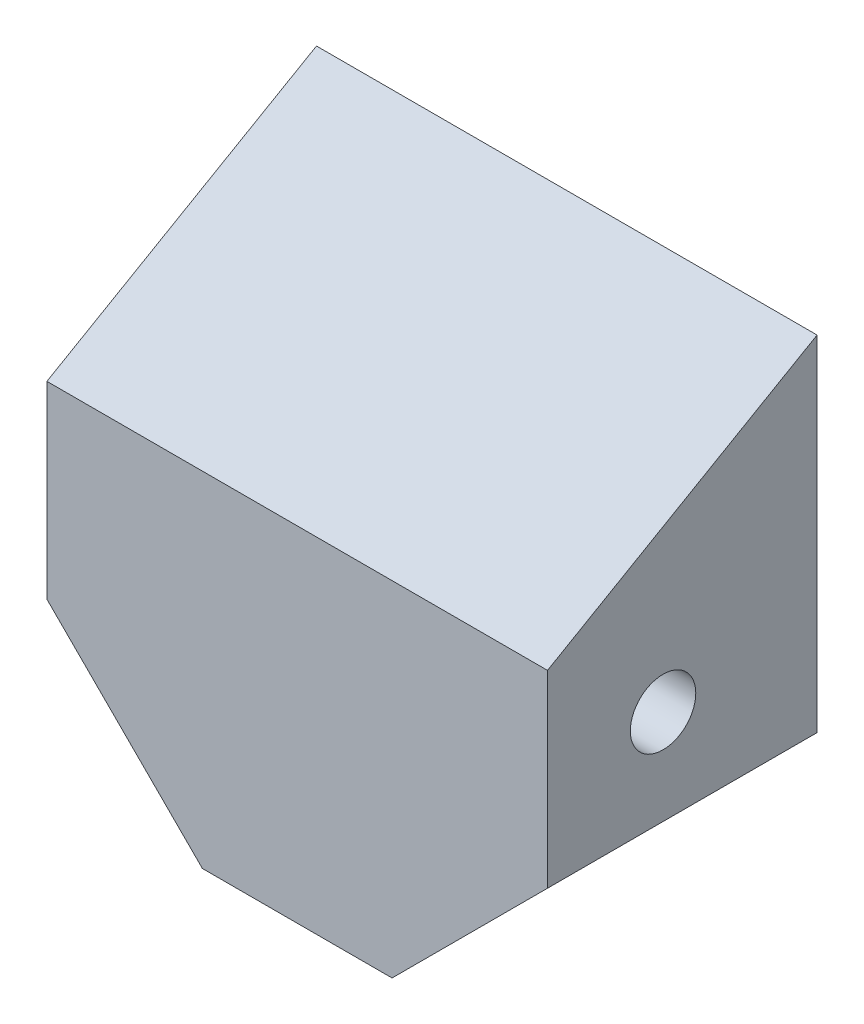
ISO-10303-21;
HEADER;
FILE_DESCRIPTION(('STEP AP214'),'2;1');
FILE_NAME('part.step','',(''),(''),'','','');
FILE_SCHEMA(('AUTOMOTIVE_DESIGN { 1 0 10303 214 1 1 1 1 }'));
ENDSEC;
DATA;
#1=APPLICATION_CONTEXT('core data for automotive mechanical design processes');
#2=APPLICATION_PROTOCOL_DEFINITION('international standard','automotive_design',2000,#1);
#3=PRODUCT_CONTEXT('',#1,'mechanical');
#4=PRODUCT('Part','Part','',(#3));
#5=PRODUCT_RELATED_PRODUCT_CATEGORY('part','',(#4));
#6=PRODUCT_DEFINITION_FORMATION('','',#4);
#7=PRODUCT_DEFINITION_CONTEXT('part definition',#1,'design');
#8=PRODUCT_DEFINITION('design','',#6,#7);
#9=PRODUCT_DEFINITION_SHAPE('','',#8);
#10=(LENGTH_UNIT() NAMED_UNIT(*) SI_UNIT(.MILLI.,.METRE.));
#11=(NAMED_UNIT(*) PLANE_ANGLE_UNIT() SI_UNIT($,.RADIAN.));
#12=(NAMED_UNIT(*) SI_UNIT($,.STERADIAN.) SOLID_ANGLE_UNIT());
#13=UNCERTAINTY_MEASURE_WITH_UNIT(LENGTH_MEASURE(1.E-05),#10,'distance_accuracy_value','');
#14=(GEOMETRIC_REPRESENTATION_CONTEXT(3) GLOBAL_UNCERTAINTY_ASSIGNED_CONTEXT((#13)) GLOBAL_UNIT_ASSIGNED_CONTEXT((#10,
#11,#12)) REPRESENTATION_CONTEXT('',''));
#15=CARTESIAN_POINT('',(0.,0.,0.));
#16=DIRECTION('',(0.,0.,1.));
#17=DIRECTION('',(1.,0.,0.));
#18=AXIS2_PLACEMENT_3D('',#15,#16,#17);
#19=CARTESIAN_POINT('',(165.1,-165.1,177.8));
#20=DIRECTION('',(-1.,0.,0.));
#21=DIRECTION('',(0.,0.,1.));
#22=AXIS2_PLACEMENT_3D('',#19,#20,#21);
#23=PLANE('',#22);
#24=CARTESIAN_POINT('',(165.1,0.,101.6));
#25=DIRECTION('',(-1.,0.,0.));
#26=DIRECTION('',(0.,0.,1.));
#27=AXIS2_PLACEMENT_3D('',#24,#25,#26);
#28=CIRCLE('',#27,21.59);
#29=CARTESIAN_POINT('',(165.1,0.,123.19));
#30=VERTEX_POINT('',#29);
#31=EDGE_CURVE('E135',#30,#30,#28,.T.);
#32=ORIENTED_EDGE('',*,*,#31,.T.);
#33=EDGE_LOOP('',(#32));
#34=FACE_BOUND('',#33,.T.);
#35=DIRECTION('',(0.,1.,0.));
#36=VECTOR('',#35,1.);
#37=CARTESIAN_POINT('',(165.1,-165.1,177.8));
#38=LINE('',#37,#36);
#39=CARTESIAN_POINT('',(165.1,-62.5599968000001,177.8));
#40=VERTEX_POINT('',#39);
#41=CARTESIAN_POINT('',(165.1,61.9044110375234,177.8));
#42=VERTEX_POINT('',#41);
#43=EDGE_CURVE('E140',#40,#42,#38,.T.);
#44=ORIENTED_EDGE('',*,*,#43,.F.);
#45=DIRECTION('',(0.,0.,-1.));
#46=VECTOR('',#45,1.);
#47=CARTESIAN_POINT('',(165.1,-62.5599968000001,177.8));
#48=LINE('',#47,#46);
#49=CARTESIAN_POINT('',(165.1,-62.5599968000001,0.));
#50=VERTEX_POINT('',#49);
#51=EDGE_CURVE('E214',#40,#50,#48,.T.);
#52=ORIENTED_EDGE('',*,*,#51,.T.);
#53=DIRECTION('',(0.,1.,0.));
#54=VECTOR('',#53,1.);
#55=CARTESIAN_POINT('',(165.1,-165.1,0.));
#56=LINE('',#55,#54);
#57=CARTESIAN_POINT('',(165.1,164.55728889944,0.));
#58=VERTEX_POINT('',#57);
#59=EDGE_CURVE('E139',#50,#58,#56,.T.);
#60=ORIENTED_EDGE('',*,*,#59,.T.);
#61=DIRECTION('',(0.,0.500000000000006,-0.866025403784435));
#62=VECTOR('',#61,1.);
#63=CARTESIAN_POINT('',(165.1,61.9044110375234,177.8));
#64=LINE('',#63,#62);
#65=EDGE_CURVE('E236',#58,#42,#64,.F.);
#66=ORIENTED_EDGE('',*,*,#65,.T.);
#67=EDGE_LOOP('',(#44,#52,#60,#66));
#68=FACE_BOUND('',#67,.T.);
#69=ADVANCED_FACE('F41',(#34,#68),#23,.F.);
#70=CARTESIAN_POINT('',(-165.1,-165.1,177.8));
#71=DIRECTION('',(1.,0.,0.));
#72=DIRECTION('',(0.,0.,-1.));
#73=AXIS2_PLACEMENT_3D('',#70,#71,#72);
#74=PLANE('',#73);
#75=CARTESIAN_POINT('',(-165.1,0.,101.6));
#76=DIRECTION('',(1.,0.,0.));
#77=DIRECTION('',(0.,0.,-1.));
#78=AXIS2_PLACEMENT_3D('',#75,#76,#77);
#79=CIRCLE('',#78,21.59);
#80=CARTESIAN_POINT('',(-165.1,0.,80.01));
#81=VERTEX_POINT('',#80);
#82=EDGE_CURVE('E131',#81,#81,#79,.T.);
#83=ORIENTED_EDGE('',*,*,#82,.T.);
#84=EDGE_LOOP('',(#83));
#85=FACE_BOUND('',#84,.T.);
#86=DIRECTION('',(0.,-1.,0.));
#87=VECTOR('',#86,1.);
#88=CARTESIAN_POINT('',(-165.1,-165.1,0.));
#89=LINE('',#88,#87);
#90=CARTESIAN_POINT('',(-165.1,164.55728889944,0.));
#91=VERTEX_POINT('',#90);
#92=CARTESIAN_POINT('',(-165.1,-62.5599967999997,0.));
#93=VERTEX_POINT('',#92);
#94=EDGE_CURVE('E152',#91,#93,#89,.T.);
#95=ORIENTED_EDGE('',*,*,#94,.T.);
#96=DIRECTION('',(0.,0.,1.));
#97=VECTOR('',#96,1.);
#98=CARTESIAN_POINT('',(-165.1,-62.5599967999997,177.8));
#99=LINE('',#98,#97);
#100=CARTESIAN_POINT('',(-165.1,-62.5599967999997,177.8));
#101=VERTEX_POINT('',#100);
#102=EDGE_CURVE('E11',#93,#101,#99,.T.);
#103=ORIENTED_EDGE('',*,*,#102,.T.);
#104=DIRECTION('',(0.,-1.,0.));
#105=VECTOR('',#104,1.);
#106=CARTESIAN_POINT('',(-165.1,-165.1,177.8));
#107=LINE('',#106,#105);
#108=CARTESIAN_POINT('',(-165.1,61.9044110375234,177.8));
#109=VERTEX_POINT('',#108);
#110=EDGE_CURVE('E143',#109,#101,#107,.T.);
#111=ORIENTED_EDGE('',*,*,#110,.F.);
#112=DIRECTION('',(0.,-0.500000000000006,0.866025403784435));
#113=VECTOR('',#112,1.);
#114=CARTESIAN_POINT('',(-165.1,61.9044110375234,177.8));
#115=LINE('',#114,#113);
#116=EDGE_CURVE('E244',#109,#91,#115,.F.);
#117=ORIENTED_EDGE('',*,*,#116,.T.);
#118=EDGE_LOOP('',(#95,#103,#111,#117));
#119=FACE_BOUND('',#118,.T.);
#120=ADVANCED_FACE('F188',(#85,#119),#74,.F.);
#121=CARTESIAN_POINT('',(-165.1,-165.1,177.8));
#122=DIRECTION('',(0.,1.,0.));
#123=DIRECTION('',(0.,0.,1.));
#124=AXIS2_PLACEMENT_3D('',#121,#122,#123);
#125=PLANE('',#124);
#126=CARTESIAN_POINT('',(0.,-165.1,101.6));
#127=DIRECTION('',(0.,-1.,0.));
#128=DIRECTION('',(0.,0.,-1.));
#129=AXIS2_PLACEMENT_3D('',#126,#127,#128);
#130=CIRCLE('',#129,21.59);
#131=CARTESIAN_POINT('',(0.,-165.1,80.01));
#132=VERTEX_POINT('',#131);
#133=EDGE_CURVE('E122',#132,#132,#130,.T.);
#134=ORIENTED_EDGE('',*,*,#133,.F.);
#135=EDGE_LOOP('',(#134));
#136=FACE_BOUND('',#135,.T.);
#137=DIRECTION('',(1.,0.,0.));
#138=VECTOR('',#137,1.);
#139=CARTESIAN_POINT('',(-165.1,-165.1,0.));
#140=LINE('',#139,#138);
#141=CARTESIAN_POINT('',(-62.5599968000001,-165.1,0.));
#142=VERTEX_POINT('',#141);
#143=CARTESIAN_POINT('',(62.5599967999997,-165.1,0.));
#144=VERTEX_POINT('',#143);
#145=EDGE_CURVE('E144',#142,#144,#140,.T.);
#146=ORIENTED_EDGE('',*,*,#145,.T.);
#147=DIRECTION('',(0.,0.,1.));
#148=VECTOR('',#147,1.);
#149=CARTESIAN_POINT('',(62.5599967999997,-165.1,177.8));
#150=LINE('',#149,#148);
#151=CARTESIAN_POINT('',(62.5599967999997,-165.1,177.8));
#152=VERTEX_POINT('',#151);
#153=EDGE_CURVE('E64',#144,#152,#150,.T.);
#154=ORIENTED_EDGE('',*,*,#153,.T.);
#155=DIRECTION('',(1.,0.,0.));
#156=VECTOR('',#155,1.);
#157=CARTESIAN_POINT('',(-165.1,-165.1,177.8));
#158=LINE('',#157,#156);
#159=CARTESIAN_POINT('',(-62.5599968000001,-165.1,177.8));
#160=VERTEX_POINT('',#159);
#161=EDGE_CURVE('E147',#160,#152,#158,.T.);
#162=ORIENTED_EDGE('',*,*,#161,.F.);
#163=DIRECTION('',(0.,0.,-1.));
#164=VECTOR('',#163,1.);
#165=CARTESIAN_POINT('',(-62.5599968000001,-165.1,177.8));
#166=LINE('',#165,#164);
#167=EDGE_CURVE('E224',#160,#142,#166,.T.);
#168=ORIENTED_EDGE('',*,*,#167,.T.);
#169=EDGE_LOOP('',(#146,#154,#162,#168));
#170=FACE_BOUND('',#169,.T.);
#171=ADVANCED_FACE('F194',(#136,#170),#125,.F.);
#172=CARTESIAN_POINT('',(0.,0.,177.8));
#173=DIRECTION('',(0.,0.,-1.));
#174=DIRECTION('',(-1.,0.,0.));
#175=AXIS2_PLACEMENT_3D('',#172,#173,#174);
#176=PLANE('',#175);
#177=ORIENTED_EDGE('',*,*,#161,.T.);
#178=DIRECTION('',(-0.707106781186549,-0.707106781186546,0.));
#179=VECTOR('',#178,1.);
#180=CARTESIAN_POINT('',(165.1,-62.5599968000001,177.8));
#181=LINE('',#180,#179);
#182=EDGE_CURVE('E51',#152,#40,#181,.F.);
#183=ORIENTED_EDGE('',*,*,#182,.T.);
#184=ORIENTED_EDGE('',*,*,#43,.T.);
#185=DIRECTION('',(-1.,0.,0.));
#186=VECTOR('',#185,1.);
#187=CARTESIAN_POINT('',(0.,61.9044110375234,177.8));
#188=LINE('',#187,#186);
#189=EDGE_CURVE('E246',#42,#109,#188,.T.);
#190=ORIENTED_EDGE('',*,*,#189,.T.);
#191=ORIENTED_EDGE('',*,*,#110,.T.);
#192=DIRECTION('',(-0.707106781186546,0.707106781186549,0.));
#193=VECTOR('',#192,1.);
#194=CARTESIAN_POINT('',(-62.5599968000001,-165.1,177.8));
#195=LINE('',#194,#193);
#196=EDGE_CURVE('E218',#101,#160,#195,.F.);
#197=ORIENTED_EDGE('',*,*,#196,.T.);
#198=EDGE_LOOP('',(#177,#183,#184,#190,#191,#197));
#199=FACE_BOUND('',#198,.T.);
#200=ADVANCED_FACE('F252',(#199),#176,.F.);
#201=CARTESIAN_POINT('',(0.,0.,0.));
#202=DIRECTION('',(0.,0.,-1.));
#203=DIRECTION('',(-1.,0.,0.));
#204=AXIS2_PLACEMENT_3D('',#201,#202,#203);
#205=PLANE('',#204);
#206=CARTESIAN_POINT('',(0.,0.,0.));
#207=DIRECTION('',(0.,0.,-1.));
#208=DIRECTION('',(-1.,0.,0.));
#209=AXIS2_PLACEMENT_3D('',#206,#207,#208);
#210=CIRCLE('',#209,8.382);
#211=CARTESIAN_POINT('',(-8.382,0.,0.));
#212=VERTEX_POINT('',#211);
#213=EDGE_CURVE('E116',#212,#212,#210,.T.);
#214=ORIENTED_EDGE('',*,*,#213,.F.);
#215=EDGE_LOOP('',(#214));
#216=FACE_BOUND('',#215,.T.);
#217=ORIENTED_EDGE('',*,*,#59,.F.);
#218=DIRECTION('',(0.707106781186549,0.707106781186546,0.));
#219=VECTOR('',#218,1.);
#220=CARTESIAN_POINT('',(113.8299984,-113.8299984,0.));
#221=LINE('',#220,#219);
#222=EDGE_CURVE('E228',#50,#144,#221,.F.);
#223=ORIENTED_EDGE('',*,*,#222,.T.);
#224=ORIENTED_EDGE('',*,*,#145,.F.);
#225=DIRECTION('',(0.707106781186546,-0.707106781186549,0.));
#226=VECTOR('',#225,1.);
#227=CARTESIAN_POINT('',(-113.8299984,-113.8299984,0.));
#228=LINE('',#227,#226);
#229=EDGE_CURVE('E231',#142,#93,#228,.F.);
#230=ORIENTED_EDGE('',*,*,#229,.T.);
#231=ORIENTED_EDGE('',*,*,#94,.F.);
#232=DIRECTION('',(-1.,0.,0.));
#233=VECTOR('',#232,1.);
#234=CARTESIAN_POINT('',(0.,164.55728889944,0.));
#235=LINE('',#234,#233);
#236=EDGE_CURVE('E240',#91,#58,#235,.F.);
#237=ORIENTED_EDGE('',*,*,#236,.T.);
#238=EDGE_LOOP('',(#217,#223,#224,#230,#231,#237));
#239=FACE_BOUND('',#238,.T.);
#240=ADVANCED_FACE('F259',(#216,#239),#205,.T.);
#241=CARTESIAN_POINT('',(-165.1,0.,101.6));
#242=DIRECTION('',(1.,0.,0.));
#243=DIRECTION('',(0.,0.,-1.));
#244=AXIS2_PLACEMENT_3D('',#241,#242,#243);
#245=CYLINDRICAL_SURFACE('',#244,21.59);
#246=CARTESIAN_POINT('',(0.,0.,101.6));
#247=DIRECTION('',(0.707106781186547,0.707106781186547,0.));
#248=DIRECTION('',(0.707106781186547,-0.707106781186547,0.));
#249=AXIS2_PLACEMENT_3D('',#246,#247,#248);
#250=ELLIPSE('',#249,30.5328708116351,21.59);
#251=CARTESIAN_POINT('',(5.92696903990567,-5.92696903990561,80.8394812685232));
#252=VERTEX_POINT('',#251);
#253=CARTESIAN_POINT('',(0.,0.,123.19));
#254=VERTEX_POINT('',#253);
#255=EDGE_CURVE('E109',#252,#254,#250,.F.);
#256=ORIENTED_EDGE('',*,*,#255,.T.);
#257=CARTESIAN_POINT('',(0.,0.,101.6));
#258=DIRECTION('',(0.707106781186547,-0.707106781186547,0.));
#259=DIRECTION('',(0.707106781186547,0.707106781186547,0.));
#260=AXIS2_PLACEMENT_3D('',#257,#258,#259);
#261=ELLIPSE('',#260,30.5328708116351,21.59);
#262=CARTESIAN_POINT('',(-5.92696903990567,-5.92696903990562,80.8394812685232));
#263=VERTEX_POINT('',#262);
#264=EDGE_CURVE('E106',#254,#263,#261,.T.);
#265=ORIENTED_EDGE('',*,*,#264,.T.);
#266=CARTESIAN_POINT('',(-8.382,0.,80.01));
#267=CARTESIAN_POINT('',(-8.38200145033635,0.226370568657788,80.0099989138097));
#268=CARTESIAN_POINT('',(-8.37282289777785,0.452721919749313,80.0135677018226));
#269=CARTESIAN_POINT('',(-8.33620935186898,0.903720958138195,80.0277429909222));
#270=CARTESIAN_POINT('',(-8.30877497383841,1.12836870259818,80.0383492548081));
#271=CARTESIAN_POINT('',(-8.23594044078842,1.57423889942899,80.0663109489509));
#272=CARTESIAN_POINT('',(-8.19054489182278,1.79546221487572,80.0836646488415));
#273=CARTESIAN_POINT('',(-8.08223369184876,2.23298328766616,80.1246614266243));
#274=CARTESIAN_POINT('',(-8.01931745798016,2.44928088088697,80.1483047137509));
#275=CARTESIAN_POINT('',(-7.87670897876559,2.87500684270109,80.2012068358184));
#276=CARTESIAN_POINT('',(-7.79705489401773,3.08444960523504,80.2304528838626));
#277=CARTESIAN_POINT('',(-7.62153385444664,3.49573405586599,80.2938680589026));
#278=CARTESIAN_POINT('',(-7.52566125098669,3.69757306565513,80.3280389005049));
#279=CARTESIAN_POINT('',(-7.31848123842625,4.09236465925206,80.4004498210225));
#280=CARTESIAN_POINT('',(-7.207175697474,4.28531831486664,80.4386894072885));
#281=CARTESIAN_POINT('',(-6.96986595234745,4.66136744403012,80.5183323129778));
#282=CARTESIAN_POINT('',(-6.84385643228888,4.84445931709716,80.5597367747112));
#283=CARTESIAN_POINT('',(-6.57259960517665,5.2069328120414,80.6464306918641));
#284=CARTESIAN_POINT('',(-6.42678059920686,5.38586537744169,80.6918095318447));
#285=CARTESIAN_POINT('',(-6.12105997324607,5.7309414018714,80.7837491053967));
#286=CARTESIAN_POINT('',(-5.96115790750256,5.89708445577914,80.8303098763449));
#287=CARTESIAN_POINT('',(-5.62813037716263,6.21572252971234,80.9234320661311));
#288=CARTESIAN_POINT('',(-5.4549984522609,6.36821080198187,80.969993474041));
#289=CARTESIAN_POINT('',(-5.09661473983286,6.65849849275185,81.061848382183));
#290=CARTESIAN_POINT('',(-4.91136704158587,6.79630282646349,81.1071423029188));
#291=CARTESIAN_POINT('',(-4.5217107629924,7.06186561226161,81.1970926206819));
#292=CARTESIAN_POINT('',(-4.31682442472723,7.18896038017676,81.2416426163655));
#293=CARTESIAN_POINT('',(-3.89629330397689,7.42529270322454,81.3266455464998));
#294=CARTESIAN_POINT('',(-3.68065290495948,7.5345374578035,81.3671001302359));
#295=CARTESIAN_POINT('',(-3.23996605565272,7.73427812179693,81.442608080843));
#296=CARTESIAN_POINT('',(-3.0149207240576,7.82477625349242,81.477662087788));
#297=CARTESIAN_POINT('',(-2.55699641432717,7.98615146768632,81.5411611673985));
#298=CARTESIAN_POINT('',(-2.32411793427076,8.05702979509524,81.5696066593672));
#299=CARTESIAN_POINT('',(-1.86253332187649,8.17576904998631,81.6177872083411));
#300=CARTESIAN_POINT('',(-1.63408319967396,8.22449379590704,81.6378461150302));
#301=CARTESIAN_POINT('',(-1.17337573712479,8.30275250584003,81.6702683731867));
#302=CARTESIAN_POINT('',(-0.941118500917671,8.33228699388605,81.6826319347927));
#303=CARTESIAN_POINT('',(-0.474746981557583,8.37181492579503,81.6992141771231));
#304=CARTESIAN_POINT('',(-0.240633455849082,8.38181596577191,81.7034360239672));
#305=CARTESIAN_POINT('',(0.227606450540261,8.3821789727159,81.703588795554));
#306=CARTESIAN_POINT('',(0.46173283024255,8.37254177991938,81.6995200750148));
#307=CARTESIAN_POINT('',(0.912860372796346,8.33501401190719,81.6837750983014));
#308=CARTESIAN_POINT('',(1.12998322606291,8.30835393281725,81.6726119025991));
#309=CARTESIAN_POINT('',(1.5611159485187,8.23823729429393,81.6435227032893));
#310=CARTESIAN_POINT('',(1.77512471005417,8.19477490298474,81.6255943516313));
#311=CARTESIAN_POINT('',(2.1984645277233,8.09148570436307,81.5835302461839));
#312=CARTESIAN_POINT('',(2.40779677973882,8.03166313372861,81.5593960995611));
#313=CARTESIAN_POINT('',(2.82061546219126,7.89615534332456,81.505619179306));
#314=CARTESIAN_POINT('',(3.02409961657062,7.82046404007936,81.4759742935587));
#315=CARTESIAN_POINT('',(3.4278301632969,7.65223177243254,81.4113963320718));
#316=CARTESIAN_POINT('',(3.62793791113702,7.55939335228058,81.3763721023516));
#317=CARTESIAN_POINT('',(4.01971908479984,7.35855015480923,81.3024314503409));
#318=CARTESIAN_POINT('',(4.21138962043266,7.25054023273912,81.2635137090299));
#319=CARTESIAN_POINT('',(4.58524536503745,7.02009076008704,81.1828178540164));
#320=CARTESIAN_POINT('',(4.76742938946858,6.89764941371342,81.1410393846074));
#321=CARTESIAN_POINT('',(5.12137364149001,6.63908839919386,81.0556786810507));
#322=CARTESIAN_POINT('',(5.29313336242037,6.50296806705091,81.012096359402));
#323=CARTESIAN_POINT('',(5.63744866169182,6.20743417818956,80.9209896378856));
#324=CARTESIAN_POINT('',(5.80915461552773,6.0470466853502,80.8734089627864));
#325=CARTESIAN_POINT('',(6.13851071157491,5.71241713044194,80.7786980608922));
#326=CARTESIAN_POINT('',(6.29616504123651,5.53817922534134,80.7315677036634));
#327=CARTESIAN_POINT('',(6.59657740056903,5.17671173739009,80.6389748331717));
#328=CARTESIAN_POINT('',(6.73932712093208,4.98947500351757,80.5935132593147));
#329=CARTESIAN_POINT('',(7.00880119947126,4.60326515222091,80.5055160117842));
#330=CARTESIAN_POINT('',(7.13553195325256,4.4042967655087,80.462979173517));
#331=CARTESIAN_POINT('',(7.37423107855262,3.99204118203067,80.3812192996153));
#332=CARTESIAN_POINT('',(7.48588971162069,3.77855962401164,80.3420704354502));
#333=CARTESIAN_POINT('',(7.69066334190654,3.34210982676781,80.2690992614042));
#334=CARTESIAN_POINT('',(7.78378622402351,3.1191456705321,80.2352746879167));
#335=CARTESIAN_POINT('',(7.95064225998697,2.66526927782709,80.1739208817295));
#336=CARTESIAN_POINT('',(8.02437857879124,2.43435834568016,80.1463906215461));
#337=CARTESIAN_POINT('',(8.15170432405794,1.96632772827397,80.0984424938882));
#338=CARTESIAN_POINT('',(8.20529505437069,1.72920844589058,80.0780241661258));
#339=CARTESIAN_POINT('',(8.28929449510487,1.26418406424981,80.0458550388869));
#340=CARTESIAN_POINT('',(8.32083970614812,1.03651304548717,80.0336805246555));
#341=CARTESIAN_POINT('',(8.36512899136158,0.57908115672036,80.0165540602865));
#342=CARTESIAN_POINT('',(8.3778737720339,0.349320365574332,80.0116018387422));
#343=CARTESIAN_POINT('',(8.38442448126611,-0.11046210452078,80.0090588109095));
#344=CARTESIAN_POINT('',(8.37823439726684,-0.34048371834621,80.0114664547272));
#345=CARTESIAN_POINT('',(8.34699112192023,-0.79904571629887,80.0235723768935));
#346=CARTESIAN_POINT('',(8.3219382554407,-1.02758612586805,80.0332705296799));
#347=CARTESIAN_POINT('',(8.25468485647107,-1.47188476695224,80.0591299612001));
#348=CARTESIAN_POINT('',(8.21324978067462,-1.68777635029091,80.0750022798421));
#349=CARTESIAN_POINT('',(8.11369008155528,-2.11521336057164,80.1127939953362));
#350=CARTESIAN_POINT('',(8.05555960011768,-2.32675723401408,80.134715514637));
#351=CARTESIAN_POINT('',(7.92315008642559,-2.74399544762673,80.1840547074943));
#352=CARTESIAN_POINT('',(7.84887567768209,-2.94969144355583,80.2114708072655));
#353=CARTESIAN_POINT('',(7.6847508701546,-3.35412821454461,80.2711526612862));
#354=CARTESIAN_POINT('',(7.59489455187045,-3.5528663117172,80.3034202579767));
#355=CARTESIAN_POINT('',(7.39741143324641,-3.94796691311622,80.3730575983945));
#356=CARTESIAN_POINT('',(7.28933597203511,-4.14408339886614,80.4105504485543));
#357=CARTESIAN_POINT('',(7.05816074807445,-4.52661633501834,80.4889605928592));
#358=CARTESIAN_POINT('',(6.93505583065644,-4.71302942599412,80.5298790603712));
#359=CARTESIAN_POINT('',(6.67464398537264,-5.07511477606928,80.6141506965643));
#360=CARTESIAN_POINT('',(6.5373347972498,-5.25078531866048,80.657504252226));
#361=CARTESIAN_POINT('',(6.24935720463141,-5.59044171749288,80.7456035624353));
#362=CARTESIAN_POINT('',(6.09868826325246,-5.75442710366903,80.7903493728859));
#363=CARTESIAN_POINT('',(5.77502191158471,-6.07971398936137,80.8829651150677));
#364=CARTESIAN_POINT('',(5.60121762802773,-6.24020787670238,80.9308555904454));
#365=CARTESIAN_POINT('',(5.24057469672656,-6.54600482257277,81.0256580776639));
#366=CARTESIAN_POINT('',(5.05374018422598,-6.69131266426323,81.072570393847));
#367=CARTESIAN_POINT('',(4.66796790761882,-6.96592306595939,81.1641251465461));
#368=CARTESIAN_POINT('',(4.46902371295206,-7.09521700960468,81.2087663535342));
#369=CARTESIAN_POINT('',(4.0603861122567,-7.33672201623662,81.2944090043023));
#370=CARTESIAN_POINT('',(3.85069727781438,-7.44894026515864,81.3354119761093));
#371=CARTESIAN_POINT('',(3.4201995839209,-7.65621639981817,81.4128063210861));
#372=CARTESIAN_POINT('',(3.19931973649926,-7.75114072537747,81.4491612043127));
#373=CARTESIAN_POINT('',(2.74949026947134,-7.92187288175816,81.5156670615244));
#374=CARTESIAN_POINT('',(2.52054432602657,-7.99768929586253,81.5458208199335));
#375=CARTESIAN_POINT('',(2.05625673222925,-8.1294489525053,81.5988697702932));
#376=CARTESIAN_POINT('',(1.82091727824699,-8.18539892913011,81.6217674215484));
#377=CARTESIAN_POINT('',(1.34565816937513,-8.27681525780177,81.6594662639424));
#378=CARTESIAN_POINT('',(1.10573886823107,-8.31228318531336,81.6742680778028));
#379=CARTESIAN_POINT('',(0.63986257991367,-8.3605943481756,81.6944934346546));
#380=CARTESIAN_POINT('',(0.414072684809401,-8.37481883191999,81.7004890588125));
#381=CARTESIAN_POINT('',(-0.0379859841309769,-8.38496203759582,81.7047607194616));
#382=CARTESIAN_POINT('',(-0.264254734660955,-8.38088163084628,81.7030371233903));
#383=CARTESIAN_POINT('',(-0.715506668702875,-8.35446310992102,81.6919300741066));
#384=CARTESIAN_POINT('',(-0.94048998276577,-8.33212688426212,81.6825474132045));
#385=CARTESIAN_POINT('',(-1.38749750172483,-8.26944443510608,81.6564411880055));
#386=CARTESIAN_POINT('',(-1.60952171425596,-8.22909825808684,81.6397176426529));
#387=CARTESIAN_POINT('',(-2.0412283016023,-8.13255762817336,81.6001945079381));
#388=CARTESIAN_POINT('',(-2.25106946761195,-8.07697408724542,81.5776307049591));
#389=CARTESIAN_POINT('',(-2.66525600625254,-7.94992329950459,81.5268463509436));
#390=CARTESIAN_POINT('',(-2.86959942499593,-7.87845048713459,81.4986238181565));
#391=CARTESIAN_POINT('',(-3.27149324569804,-7.72022499564789,81.4373261712307));
#392=CARTESIAN_POINT('',(-3.46904479090894,-7.63347490330218,81.4042518787571));
#393=CARTESIAN_POINT('',(-3.85634847692535,-7.4453284150777,81.3341355670596));
#394=CARTESIAN_POINT('',(-4.0460975502624,-7.34392632830307,81.2970920076074));
#395=CARTESIAN_POINT('',(-4.62237119320888,-7.00688465348687,81.177204380197));
#396=CARTESIAN_POINT('',(-4.99396542792093,-6.7470014386854,81.0890919306993));
#397=CARTESIAN_POINT('',(-5.68997276632889,-6.17140251582188,80.908635813292));
#398=CARTESIAN_POINT('',(-6.01437027849389,-5.8556684332958,80.8162907603221));
#399=CARTESIAN_POINT('',(-6.46894950417166,-5.33554261392224,80.6788388916966));
#400=CARTESIAN_POINT('',(-6.61879811198243,-5.14849042492137,80.6319130847385));
#401=CARTESIAN_POINT('',(-6.90218666705357,-4.76184088368385,80.5407418480139));
#402=CARTESIAN_POINT('',(-7.03573261820351,-4.56224819109087,80.4964954345326));
#403=CARTESIAN_POINT('',(-7.28560158398471,-4.15159612180658,80.4118822587298));
#404=CARTESIAN_POINT('',(-7.4019132546751,-3.940529316446,80.3715180578353));
#405=CARTESIAN_POINT('',(-7.61619117261011,-3.5085132680228,80.2958572337172));
#406=CARTESIAN_POINT('',(-7.71416502911981,-3.28756817131151,80.2605585100018));
#407=CARTESIAN_POINT('',(-7.89746587638564,-2.82054088400675,80.1936383716215));
#408=CARTESIAN_POINT('',(-7.98131639403413,-2.57380959048882,80.1624837181695));
#409=CARTESIAN_POINT('',(-8.12585874058074,-2.07275959363921,80.1082512657985));
#410=CARTESIAN_POINT('',(-8.18654869223499,-1.81844027707256,80.0851741216021));
#411=CARTESIAN_POINT('',(-8.28395416439022,-1.30473625787452,80.0479224797002));
#412=CARTESIAN_POINT('',(-8.32068178620789,-1.04535418028123,80.0337434884393));
#413=CARTESIAN_POINT('',(-8.36970196107865,-0.523972546332088,80.0147836092976));
#414=CARTESIAN_POINT('',(-8.38199832155941,-0.261973404223109,80.0100012570229));
#415=CARTESIAN_POINT('',(-8.382,0.,80.01));
#416=B_SPLINE_CURVE_WITH_KNOTS('',3,(#266,#267,#268,#269,#270,#271,#272,#273,#274,#275,#276,
#277,#278,#279,#280,#281,#282,#283,#284,#285,#286,#287,#288,#289,#290,#291,#292,#293,#294,#295,
#296,#297,#298,#299,#300,#301,#302,#303,#304,#305,#306,#307,#308,#309,#310,#311,#312,#313,#314,
#315,#316,#317,#318,#319,#320,#321,#322,#323,#324,#325,#326,#327,#328,#329,#330,#331,#332,#333,
#334,#335,#336,#337,#338,#339,#340,#341,#342,#343,#344,#345,#346,#347,#348,#349,#350,#351,#352,
#353,#354,#355,#356,#357,#358,#359,#360,#361,#362,#363,#364,#365,#366,#367,#368,#369,#370,#371,
#372,#373,#374,#375,#376,#377,#378,#379,#380,#381,#382,#383,#384,#385,#386,#387,#388,#389,#390,
#391,#392,#393,#394,#395,#396,#397,#398,#399,#400,#401,#402,#403,#404,#405,#406,#407,#408,#409,
#410,#411,#412,#413,#414,#415),.UNSPECIFIED.,.T.,.F.,(4,2,2,2,2,2,2,2,2,2,2,2,2,2,2,2,2,2,2,2,2,
2,2,2,2,2,2,2,2,2,2,2,2,2,2,2,2,2,2,2,2,2,2,2,2,2,2,2,2,2,2,2,2,2,2,2,2,2,2,2,2,2,2,2,2,2,2,2,2,
2,2,2,2,2,4),(0.,0.678865519999188,1.35770815972735,2.03637682632174,2.71506807286884,
3.39222844252547,4.06962514312164,4.7469399167067,5.42450032092263,6.12944614063811,
6.83441428109777,7.53972889357939,8.24480666678503,8.97945432773768,9.71380494788652,
10.4480684660264,11.1822853831909,11.8847083550473,12.5871121448362,13.2892427313306,
13.9913432772771,14.6476881899916,15.3042611167744,15.9606641763273,16.6173193377958,
17.2866692363238,17.9562466660156,18.625907503522,19.2956008630142,20.0139721596923,
20.7321286575177,21.4506834129341,22.168950371604,22.9002558508997,23.6312495731176,
24.3621238825834,25.0929508807063,25.7825803581825,26.4721839193849,27.1616422688761,
27.8510887443136,28.5115404578844,29.1722241956836,29.8327189668854,30.4934652091097,
31.173842997844,31.8544547954932,32.5351750626943,33.2159226981538,33.9391965402316,
34.6622418811986,35.3856745858023,36.1088020024479,36.8372970200052,37.5654642116454,
38.2933843417545,39.0212484733008,39.6993406926764,40.3774006349738,41.0553904426168,
41.7333785005961,42.3873903300919,43.0416316031691,43.6957622054966,44.3501475612504,
45.729619616113,47.1095463525724,47.8414675406379,48.5731183607149,49.3052486485442,
50.0370744625553,50.823165859467,51.6093209582763,52.3950787296579,53.1807140370142),.UNSPECIFIED.);
#417=EDGE_CURVE('E120',#263,#252,#416,.T.);
#418=ORIENTED_EDGE('',*,*,#417,.T.);
#419=EDGE_LOOP('',(#256,#265,#418));
#420=FACE_BOUND('',#419,.T.);
#421=ORIENTED_EDGE('',*,*,#82,.F.);
#422=EDGE_LOOP('',(#421));
#423=FACE_BOUND('',#422,.T.);
#424=ORIENTED_EDGE('',*,*,#31,.F.);
#425=EDGE_LOOP('',(#424));
#426=FACE_BOUND('',#425,.T.);
#427=ADVANCED_FACE('F118',(#420,#423,#426),#245,.F.);
#428=CARTESIAN_POINT('',(0.,0.,101.6));
#429=DIRECTION('',(0.,0.,-1.));
#430=DIRECTION('',(-1.,0.,0.));
#431=AXIS2_PLACEMENT_3D('',#428,#429,#430);
#432=CYLINDRICAL_SURFACE('',#431,8.382);
#433=ORIENTED_EDGE('',*,*,#213,.T.);
#434=EDGE_LOOP('',(#433));
#435=FACE_BOUND('',#434,.T.);
#436=ORIENTED_EDGE('',*,*,#417,.F.);
#437=CARTESIAN_POINT('',(-8.382,0.,81.7035134759928));
#438=CARTESIAN_POINT('',(-8.38203505372542,-0.22610395172242,81.7035590988825));
#439=CARTESIAN_POINT('',(-8.37285294267391,-0.452189514782555,81.6996608206185));
#440=CARTESIAN_POINT('',(-8.33631744446659,-0.902550716608962,81.6843119448765));
#441=CARTESIAN_POINT('',(-8.30897058217425,-1.12682697601732,81.6728640592635));
#442=CARTESIAN_POINT('',(-8.23650420907551,-1.57112785962483,81.6428073809982));
#443=CARTESIAN_POINT('',(-8.19145162639205,-1.79116525871673,81.6242255608619));
#444=CARTESIAN_POINT('',(-8.08403796630851,-2.22631336817299,81.5805142377746));
#445=CARTESIAN_POINT('',(-8.02167591766231,-2.44142380134848,81.5553843674128));
#446=CARTESIAN_POINT('',(-7.88031299059003,-2.86502932859441,81.4993899039426));
#447=CARTESIAN_POINT('',(-7.80133261426292,-3.07353221306374,81.468532382538));
#448=CARTESIAN_POINT('',(-7.62732389707238,-3.48301064610695,81.4019628069732));
#449=CARTESIAN_POINT('',(-7.53228955322513,-3.68398334448157,81.3662489378799));
#450=CARTESIAN_POINT('',(-7.32686555417233,-4.07727979414418,81.2909599705992));
#451=CARTESIAN_POINT('',(-7.21646878019439,-4.2695994807365,81.2513830848879));
#452=CARTESIAN_POINT('',(-6.98106120463028,-4.64453751277725,81.1694243981995));
#453=CARTESIAN_POINT('',(-6.85604510116729,-4.82715230348875,81.1270415820505));
#454=CARTESIAN_POINT('',(-6.58584124871676,-5.19020763560128,81.0384834562529));
#455=CARTESIAN_POINT('',(-6.4399724687001,-5.37012106375745,80.9922237854423));
#456=CARTESIAN_POINT('',(-6.13394606922111,-5.71718106985022,80.8990728627862));
#457=CARTESIAN_POINT('',(-5.97378806733314,-5.88432730587326,80.8521815940656));
#458=CARTESIAN_POINT('',(-5.64004611314342,-6.20494693346702,80.7589826969612));
#459=CARTESIAN_POINT('',(-5.4664572236086,-6.35841525195613,80.7126752905515));
#460=CARTESIAN_POINT('',(-5.10694619972598,-6.65061376844015,80.6218790525001));
#461=CARTESIAN_POINT('',(-4.92102835787156,-6.78934905263278,80.5773895965428));
#462=CARTESIAN_POINT('',(-4.53068680845176,-7.05611414724688,80.4897546559911));
#463=CARTESIAN_POINT('',(-4.32583112541129,-7.18354992530452,80.4467215752116));
#464=CARTESIAN_POINT('',(-3.90530409132138,-7.42056281924112,80.3650629273346));
#465=CARTESIAN_POINT('',(-3.68963715287232,-7.53014714479833,80.3264355827887));
#466=CARTESIAN_POINT('',(-3.24888452108753,-7.73054133858532,80.2546799047645));
#467=CARTESIAN_POINT('',(-3.02379971361361,-7.82135296785672,80.2215510555371));
#468=CARTESIAN_POINT('',(-2.56583280330658,-7.98332052851624,80.1617651830139));
#469=CARTESIAN_POINT('',(-2.33295116816246,-8.05447763651139,80.1351077723206));
#470=CARTESIAN_POINT('',(-1.87203297414337,-8.17358229273479,80.0901249086375));
#471=CARTESIAN_POINT('',(-1.644264619888,-8.22244520112949,80.071473196457));
#472=CARTESIAN_POINT('',(-1.18498717867612,-8.30108439338189,80.0413160065913));
#473=CARTESIAN_POINT('',(-0.953478196349615,-8.33086121015697,80.0298103293765));
#474=CARTESIAN_POINT('',(-0.488598147752807,-8.37099832172762,80.0142767984288));
#475=CARTESIAN_POINT('',(-0.255227622319735,-8.38136406350948,80.0102468469183));
#476=CARTESIAN_POINT('',(0.21156831581182,-8.3825790843681,80.0097752250489));
#477=CARTESIAN_POINT('',(0.444993726461215,-8.37342900293854,80.0133333060457));
#478=CARTESIAN_POINT('',(0.897640561414095,-8.33672307445639,80.0275438491627));
#479=CARTESIAN_POINT('',(1.11695662546656,-8.31017297109103,80.0378085654666));
#480=CARTESIAN_POINT('',(1.55250046652819,-8.23992354943919,80.0647854935853));
#481=CARTESIAN_POINT('',(1.76872713497256,-8.19621822796254,80.0814999623515));
#482=CARTESIAN_POINT('',(2.19646722876985,-8.09208830354614,80.1209462272703));
#483=CARTESIAN_POINT('',(2.40798228645596,-8.03166959144002,80.1436759031694));
#484=CARTESIAN_POINT('',(2.82509716671805,-7.89461608494466,80.1946013194183));
#485=CARTESIAN_POINT('',(3.0306947112421,-7.81797513791429,80.2227991333392));
#486=CARTESIAN_POINT('',(3.43757310030588,-7.64789753692869,80.2844155235711));
#487=CARTESIAN_POINT('',(3.63874843340651,-7.55423389540496,80.317903740484));
#488=CARTESIAN_POINT('',(4.0325408136063,-7.35157092341785,80.3889942157862));
#489=CARTESIAN_POINT('',(4.22515491724197,-7.24256637139879,80.4265978739673));
#490=CARTESIAN_POINT('',(4.60071803538817,-7.01000050707192,80.5050171715028));
#491=CARTESIAN_POINT('',(4.78366608179098,-6.88643774066843,80.5458331315712));
#492=CARTESIAN_POINT('',(5.13892815188453,-6.6255502579341,80.6297153708058));
#493=CARTESIAN_POINT('',(5.31124164698043,-6.48822485841455,80.6727817616344));
#494=CARTESIAN_POINT('',(5.65475489553289,-6.19163334566506,80.7628861441723));
#495=CARTESIAN_POINT('',(5.82521395826981,-6.03153279186796,80.8100042583322));
#496=CARTESIAN_POINT('',(6.15209765785167,-5.69773412696171,80.9043788793153));
#497=CARTESIAN_POINT('',(6.30852643275692,-5.52404005358276,80.9516353410602));
#498=CARTESIAN_POINT('',(6.60658965161404,-5.16387239726059,81.0450616778751));
#499=CARTESIAN_POINT('',(6.74821236952864,-4.9773888760555,81.0912306696119));
#500=CARTESIAN_POINT('',(7.01555203566506,-4.59290293801951,81.1811357633398));
#501=CARTESIAN_POINT('',(7.14127514859455,-4.39490502936714,81.2248728045557));
#502=CARTESIAN_POINT('',(7.37907209097841,-3.98311680386497,81.3097619908608));
#503=CARTESIAN_POINT('',(7.49069972243654,-3.76904803077426,81.3508158379154));
#504=CARTESIAN_POINT('',(7.69532977331611,-3.3313888689064,81.4276934899417));
#505=CARTESIAN_POINT('',(7.78834017370577,-3.10780261021665,81.4635195342128));
#506=CARTESIAN_POINT('',(7.95480494026736,-2.652846487974,81.5286978621036));
#507=CARTESIAN_POINT('',(8.02828286422321,-2.42148638335463,81.5580579368157));
#508=CARTESIAN_POINT('',(8.15501440579987,-1.95259471722114,81.6092892721716));
#509=CARTESIAN_POINT('',(8.20827711880861,-1.71506598266566,81.6311639002899));
#510=CARTESIAN_POINT('',(8.29458564822831,-1.2323441640418,81.6668571823866));
#511=CARTESIAN_POINT('',(8.32734538381729,-0.987090707891522,81.6805617182637));
#512=CARTESIAN_POINT('',(8.36012465126767,-0.617683287977781,81.6943089624908));
#513=CARTESIAN_POINT('',(8.36832434397913,-0.494324636679047,81.6977564388455));
#514=CARTESIAN_POINT('',(8.37926244728501,-0.247317237039491,81.7023599348043));
#515=CARTESIAN_POINT('',(8.38200060866845,-0.123668475718609,81.7035158498438));
#516=CARTESIAN_POINT('',(8.382,0.,81.7035134759928));
#517=B_SPLINE_CURVE_WITH_KNOTS('',3,(#437,#438,#439,#440,#441,#442,#443,#444,#445,#446,#447,
#448,#449,#450,#451,#452,#453,#454,#455,#456,#457,#458,#459,#460,#461,#462,#463,#464,#465,#466,
#467,#468,#469,#470,#471,#472,#473,#474,#475,#476,#477,#478,#479,#480,#481,#482,#483,#484,#485,
#486,#487,#488,#489,#490,#491,#492,#493,#494,#495,#496,#497,#498,#499,#500,#501,#502,#503,#504,
#505,#506,#507,#508,#509,#510,#511,#512,#513,#514,#515,#516),.UNSPECIFIED.,.F.,.F.,(4,2,2,2,2,2,
2,2,2,2,2,2,2,2,2,2,2,2,2,2,2,2,2,2,2,2,2,2,2,2,2,2,2,2,2,2,2,2,2,4),(0.,0.678063199339373,
1.35588296683063,2.03116482662583,2.70648458461635,3.38097603224231,4.05572024979525,
4.73077818369531,5.40608169924275,6.11386842378207,6.82167409666138,7.52974120857266,
8.23756307856162,8.97184372902657,9.70582708587012,10.4397415574361,11.1736120840919,
11.873799895018,12.5739681546119,13.2739399089244,13.9738887269438,14.6365764290724,
15.2994962350418,15.9621826840857,16.6251209234207,17.2976519172681,17.9704123752861,
18.6432400866556,19.3161012143199,20.0309561892677,20.7455996284425,21.4608048273508,
22.1757318660548,22.9094706737235,23.6428942601244,24.3754292217905,25.1076342037005,
25.8498404105738,26.2207541354963,26.5916847849143),.UNSPECIFIED.);
#518=EDGE_CURVE('E111',#263,#252,#517,.T.);
#519=ORIENTED_EDGE('',*,*,#518,.T.);
#520=EDGE_LOOP('',(#436,#519));
#521=FACE_BOUND('',#520,.T.);
#522=ADVANCED_FACE('F172',(#435,#521),#432,.F.);
#523=CARTESIAN_POINT('',(0.,0.,101.6));
#524=DIRECTION('',(0.,-1.,0.));
#525=DIRECTION('',(0.,0.,-1.));
#526=AXIS2_PLACEMENT_3D('',#523,#524,#525);
#527=CYLINDRICAL_SURFACE('',#526,21.59);
#528=ORIENTED_EDGE('',*,*,#133,.T.);
#529=EDGE_LOOP('',(#528));
#530=FACE_BOUND('',#529,.T.);
#531=ORIENTED_EDGE('',*,*,#255,.F.);
#532=ORIENTED_EDGE('',*,*,#518,.F.);
#533=ORIENTED_EDGE('',*,*,#264,.F.);
#534=EDGE_LOOP('',(#531,#532,#533));
#535=FACE_BOUND('',#534,.T.);
#536=ADVANCED_FACE('F108',(#530,#535),#527,.F.);
#537=CARTESIAN_POINT('',(0.,61.9044110375234,177.8));
#538=DIRECTION('',(0.,-0.866025403784435,-0.500000000000006));
#539=DIRECTION('',(-1.,0.,0.));
#540=AXIS2_PLACEMENT_3D('',#537,#538,#539);
#541=PLANE('',#540);
#542=ORIENTED_EDGE('',*,*,#65,.F.);
#543=ORIENTED_EDGE('',*,*,#236,.F.);
#544=ORIENTED_EDGE('',*,*,#116,.F.);
#545=ORIENTED_EDGE('',*,*,#189,.F.);
#546=EDGE_LOOP('',(#542,#543,#544,#545));
#547=FACE_BOUND('',#546,.T.);
#548=ADVANCED_FACE('F179',(#547),#541,.F.);
#549=CARTESIAN_POINT('',(165.1,-62.5599968000001,177.8));
#550=DIRECTION('',(-0.707106781186546,0.707106781186549,0.));
#551=DIRECTION('',(0.,0.,-1.));
#552=AXIS2_PLACEMENT_3D('',#549,#550,#551);
#553=PLANE('',#552);
#554=ORIENTED_EDGE('',*,*,#182,.F.);
#555=ORIENTED_EDGE('',*,*,#153,.F.);
#556=ORIENTED_EDGE('',*,*,#222,.F.);
#557=ORIENTED_EDGE('',*,*,#51,.F.);
#558=EDGE_LOOP('',(#554,#555,#556,#557));
#559=FACE_BOUND('',#558,.T.);
#560=ADVANCED_FACE('F184',(#559),#553,.F.);
#561=CARTESIAN_POINT('',(-62.5599968000001,-165.1,177.8));
#562=DIRECTION('',(0.707106781186549,0.707106781186546,0.));
#563=DIRECTION('',(0.,0.,-1.));
#564=AXIS2_PLACEMENT_3D('',#561,#562,#563);
#565=PLANE('',#564);
#566=ORIENTED_EDGE('',*,*,#196,.F.);
#567=ORIENTED_EDGE('',*,*,#102,.F.);
#568=ORIENTED_EDGE('',*,*,#229,.F.);
#569=ORIENTED_EDGE('',*,*,#167,.F.);
#570=EDGE_LOOP('',(#566,#567,#568,#569));
#571=FACE_BOUND('',#570,.T.);
#572=ADVANCED_FACE('F44',(#571),#565,.F.);
#573=CLOSED_SHELL('',(#69,#120,#171,#200,#240,#427,#522,#536,#548,#560,#572));
#574=MANIFOLD_SOLID_BREP('B2',#573);
#575=ADVANCED_BREP_SHAPE_REPRESENTATION('',(#18,#574),#14);
#576=SHAPE_DEFINITION_REPRESENTATION(#9,#575);
ENDSEC;
END-ISO-10303-21;
